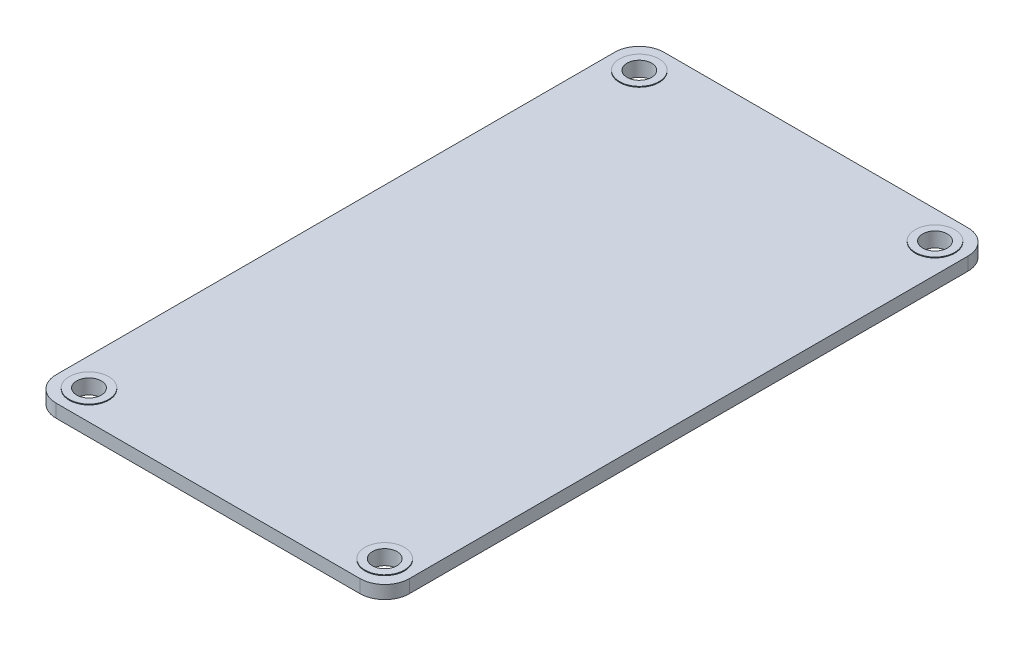
ISO-10303-21;
HEADER;
FILE_DESCRIPTION(('STEP AP214'),'2;1');
FILE_NAME('part.step','',(''),(''),'','','');
FILE_SCHEMA(('AUTOMOTIVE_DESIGN { 1 0 10303 214 1 1 1 1 }'));
ENDSEC;
DATA;
#1=APPLICATION_CONTEXT('core data for automotive mechanical design processes');
#2=APPLICATION_PROTOCOL_DEFINITION('international standard','automotive_design',2000,#1);
#3=PRODUCT_CONTEXT('',#1,'mechanical');
#4=PRODUCT('Part','Part','',(#3));
#5=PRODUCT_RELATED_PRODUCT_CATEGORY('part','',(#4));
#6=PRODUCT_DEFINITION_FORMATION('','',#4);
#7=PRODUCT_DEFINITION_CONTEXT('part definition',#1,'design');
#8=PRODUCT_DEFINITION('design','',#6,#7);
#9=PRODUCT_DEFINITION_SHAPE('','',#8);
#10=(LENGTH_UNIT() NAMED_UNIT(*) SI_UNIT(.MILLI.,.METRE.));
#11=(NAMED_UNIT(*) PLANE_ANGLE_UNIT() SI_UNIT($,.RADIAN.));
#12=(NAMED_UNIT(*) SI_UNIT($,.STERADIAN.) SOLID_ANGLE_UNIT());
#13=UNCERTAINTY_MEASURE_WITH_UNIT(LENGTH_MEASURE(1.E-05),#10,'distance_accuracy_value','');
#14=(GEOMETRIC_REPRESENTATION_CONTEXT(3) GLOBAL_UNCERTAINTY_ASSIGNED_CONTEXT((#13)) GLOBAL_UNIT_ASSIGNED_CONTEXT((#10,
#11,#12)) REPRESENTATION_CONTEXT('',''));
#15=CARTESIAN_POINT('',(0.,0.,0.));
#16=DIRECTION('',(0.,0.,1.));
#17=DIRECTION('',(1.,0.,0.));
#18=AXIS2_PLACEMENT_3D('',#15,#16,#17);
#19=CARTESIAN_POINT('',(-6.79987151274164,-0.1,12.667665293411));
#20=DIRECTION('',(0.,1.,0.));
#21=DIRECTION('',(0.,0.,1.));
#22=AXIS2_PLACEMENT_3D('',#19,#20,#21);
#23=CYLINDRICAL_SURFACE('',#22,2.4);
#24=CARTESIAN_POINT('',(-6.79987151274164,1.7,12.667665293411));
#25=DIRECTION('',(0.,1.,0.));
#26=DIRECTION('',(0.,0.,1.));
#27=AXIS2_PLACEMENT_3D('',#24,#25,#26);
#28=CIRCLE('',#27,2.4);
#29=CARTESIAN_POINT('',(-6.79987151274164,1.7,15.067665293411));
#30=VERTEX_POINT('',#29);
#31=EDGE_CURVE('P0_E19',#30,#30,#28,.T.);
#32=ORIENTED_EDGE('',*,*,#31,.F.);
#33=EDGE_LOOP('',(#32));
#34=FACE_BOUND('',#33,.T.);
#35=CARTESIAN_POINT('',(-6.79987151274164,-0.1,12.667665293411));
#36=DIRECTION('',(0.,1.,0.));
#37=DIRECTION('',(0.,0.,1.));
#38=AXIS2_PLACEMENT_3D('',#35,#36,#37);
#39=CIRCLE('',#38,2.4);
#40=CARTESIAN_POINT('',(-6.79987151274164,-0.1,15.067665293411));
#41=VERTEX_POINT('',#40);
#42=EDGE_CURVE('P0_E28',#41,#41,#39,.F.);
#43=ORIENTED_EDGE('',*,*,#42,.F.);
#44=EDGE_LOOP('',(#43));
#45=FACE_BOUND('',#44,.T.);
#46=ADVANCED_FACE('P0_F15',(#34,#45),#23,.T.);
#47=CARTESIAN_POINT('',(-9.20987151274164,1.7,10.257665293411));
#48=DIRECTION('',(0.,1.,0.));
#49=DIRECTION('',(0.,0.,1.));
#50=AXIS2_PLACEMENT_3D('',#47,#48,#49);
#51=PLANE('',#50);
#52=CARTESIAN_POINT('',(-6.79987151274164,1.7,12.667665293411));
#53=DIRECTION('',(0.,-1.,0.));
#54=DIRECTION('',(0.,0.,-1.));
#55=AXIS2_PLACEMENT_3D('',#52,#53,#54);
#56=CIRCLE('',#55,1.5);
#57=CARTESIAN_POINT('',(-6.79987151274164,1.7,11.167665293411));
#58=VERTEX_POINT('',#57);
#59=EDGE_CURVE('P0_E23',#58,#58,#56,.F.);
#60=ORIENTED_EDGE('',*,*,#59,.F.);
#61=EDGE_LOOP('',(#60));
#62=FACE_BOUND('',#61,.T.);
#63=ORIENTED_EDGE('',*,*,#31,.T.);
#64=EDGE_LOOP('',(#63));
#65=FACE_BOUND('',#64,.T.);
#66=ADVANCED_FACE('P0_F36',(#62,#65),#51,.T.);
#67=CARTESIAN_POINT('',(-9.20987151274164,-0.1,15.077665293411));
#68=DIRECTION('',(0.,-1.,0.));
#69=DIRECTION('',(0.,0.,-1.));
#70=AXIS2_PLACEMENT_3D('',#67,#68,#69);
#71=PLANE('',#70);
#72=CARTESIAN_POINT('',(-6.79987151274164,-0.1,12.667665293411));
#73=DIRECTION('',(0.,-1.,0.));
#74=DIRECTION('',(0.,0.,-1.));
#75=AXIS2_PLACEMENT_3D('',#72,#73,#74);
#76=CIRCLE('',#75,1.5);
#77=CARTESIAN_POINT('',(-6.79987151274164,-0.1,11.167665293411));
#78=VERTEX_POINT('',#77);
#79=EDGE_CURVE('P0_E10',#78,#78,#76,.T.);
#80=ORIENTED_EDGE('',*,*,#79,.F.);
#81=EDGE_LOOP('',(#80));
#82=FACE_BOUND('',#81,.T.);
#83=ORIENTED_EDGE('',*,*,#42,.T.);
#84=EDGE_LOOP('',(#83));
#85=FACE_BOUND('',#84,.T.);
#86=ADVANCED_FACE('P0_F45',(#82,#85),#71,.T.);
#87=CARTESIAN_POINT('',(-6.79987151274164,1.7,12.667665293411));
#88=DIRECTION('',(0.,-1.,0.));
#89=DIRECTION('',(0.,0.,-1.));
#90=AXIS2_PLACEMENT_3D('',#87,#88,#89);
#91=CYLINDRICAL_SURFACE('',#90,1.5);
#92=ORIENTED_EDGE('',*,*,#79,.T.);
#93=EDGE_LOOP('',(#92));
#94=FACE_BOUND('',#93,.T.);
#95=ORIENTED_EDGE('',*,*,#59,.T.);
#96=EDGE_LOOP('',(#95));
#97=FACE_BOUND('',#96,.T.);
#98=ADVANCED_FACE('P0_F17',(#94,#97),#91,.F.);
#99=CLOSED_SHELL('',(#46,#66,#86,#98));
#100=MANIFOLD_SOLID_BREP('P0_B1',#99);
#101=CARTESIAN_POINT('',(29.2001284872584,-0.1,-54.332334706589));
#102=DIRECTION('',(0.,1.,0.));
#103=DIRECTION('',(0.,0.,1.));
#104=AXIS2_PLACEMENT_3D('',#101,#102,#103);
#105=CYLINDRICAL_SURFACE('',#104,2.4);
#106=CARTESIAN_POINT('',(29.2001284872584,1.7,-54.332334706589));
#107=DIRECTION('',(0.,1.,0.));
#108=DIRECTION('',(0.,0.,1.));
#109=AXIS2_PLACEMENT_3D('',#106,#107,#108);
#110=CIRCLE('',#109,2.4);
#111=CARTESIAN_POINT('',(29.2001284872584,1.7,-51.932334706589));
#112=VERTEX_POINT('',#111);
#113=EDGE_CURVE('P1_E19',#112,#112,#110,.T.);
#114=ORIENTED_EDGE('',*,*,#113,.F.);
#115=EDGE_LOOP('',(#114));
#116=FACE_BOUND('',#115,.T.);
#117=CARTESIAN_POINT('',(29.2001284872584,-0.1,-54.332334706589));
#118=DIRECTION('',(0.,1.,0.));
#119=DIRECTION('',(0.,0.,1.));
#120=AXIS2_PLACEMENT_3D('',#117,#118,#119);
#121=CIRCLE('',#120,2.4);
#122=CARTESIAN_POINT('',(29.2001284872584,-0.1,-51.932334706589));
#123=VERTEX_POINT('',#122);
#124=EDGE_CURVE('P1_E28',#123,#123,#121,.F.);
#125=ORIENTED_EDGE('',*,*,#124,.F.);
#126=EDGE_LOOP('',(#125));
#127=FACE_BOUND('',#126,.T.);
#128=ADVANCED_FACE('P1_F15',(#116,#127),#105,.T.);
#129=CARTESIAN_POINT('',(26.7901284872584,1.7,-56.742334706589));
#130=DIRECTION('',(0.,1.,0.));
#131=DIRECTION('',(0.,0.,1.));
#132=AXIS2_PLACEMENT_3D('',#129,#130,#131);
#133=PLANE('',#132);
#134=CARTESIAN_POINT('',(29.2001284872584,1.7,-54.332334706589));
#135=DIRECTION('',(0.,-1.,0.));
#136=DIRECTION('',(0.,0.,-1.));
#137=AXIS2_PLACEMENT_3D('',#134,#135,#136);
#138=CIRCLE('',#137,1.50000000000001);
#139=CARTESIAN_POINT('',(29.2001284872584,1.7,-55.832334706589));
#140=VERTEX_POINT('',#139);
#141=EDGE_CURVE('P1_E23',#140,#140,#138,.F.);
#142=ORIENTED_EDGE('',*,*,#141,.F.);
#143=EDGE_LOOP('',(#142));
#144=FACE_BOUND('',#143,.T.);
#145=ORIENTED_EDGE('',*,*,#113,.T.);
#146=EDGE_LOOP('',(#145));
#147=FACE_BOUND('',#146,.T.);
#148=ADVANCED_FACE('P1_F36',(#144,#147),#133,.T.);
#149=CARTESIAN_POINT('',(26.7901284872584,-0.1,-51.922334706589));
#150=DIRECTION('',(0.,-1.,0.));
#151=DIRECTION('',(0.,0.,-1.));
#152=AXIS2_PLACEMENT_3D('',#149,#150,#151);
#153=PLANE('',#152);
#154=CARTESIAN_POINT('',(29.2001284872584,-0.1,-54.332334706589));
#155=DIRECTION('',(0.,-1.,0.));
#156=DIRECTION('',(0.,0.,-1.));
#157=AXIS2_PLACEMENT_3D('',#154,#155,#156);
#158=CIRCLE('',#157,1.50000000000001);
#159=CARTESIAN_POINT('',(29.2001284872584,-0.1,-55.832334706589));
#160=VERTEX_POINT('',#159);
#161=EDGE_CURVE('P1_E10',#160,#160,#158,.T.);
#162=ORIENTED_EDGE('',*,*,#161,.F.);
#163=EDGE_LOOP('',(#162));
#164=FACE_BOUND('',#163,.T.);
#165=ORIENTED_EDGE('',*,*,#124,.T.);
#166=EDGE_LOOP('',(#165));
#167=FACE_BOUND('',#166,.T.);
#168=ADVANCED_FACE('P1_F45',(#164,#167),#153,.T.);
#169=CARTESIAN_POINT('',(29.2001284872584,1.7,-54.332334706589));
#170=DIRECTION('',(0.,-1.,0.));
#171=DIRECTION('',(0.,0.,-1.));
#172=AXIS2_PLACEMENT_3D('',#169,#170,#171);
#173=CYLINDRICAL_SURFACE('',#172,1.50000000000001);
#174=ORIENTED_EDGE('',*,*,#161,.T.);
#175=EDGE_LOOP('',(#174));
#176=FACE_BOUND('',#175,.T.);
#177=ORIENTED_EDGE('',*,*,#141,.T.);
#178=EDGE_LOOP('',(#177));
#179=FACE_BOUND('',#178,.T.);
#180=ADVANCED_FACE('P1_F17',(#176,#179),#173,.F.);
#181=CLOSED_SHELL('',(#128,#148,#168,#180));
#182=MANIFOLD_SOLID_BREP('P1_B1',#181);
#183=CARTESIAN_POINT('',(-10.2998715127416,-0.01,-54.842334706589));
#184=DIRECTION('',(-1.,0.,0.));
#185=DIRECTION('',(0.,0.,1.));
#186=AXIS2_PLACEMENT_3D('',#183,#184,#185);
#187=PLANE('',#186);
#188=DIRECTION('',(0.,0.,1.));
#189=VECTOR('',#188,1.);
#190=CARTESIAN_POINT('',(-10.2998715127416,1.6,-20.832334706589));
#191=LINE('',#190,#189);
#192=CARTESIAN_POINT('',(-10.2998715127416,1.6,-54.832334706589));
#193=VERTEX_POINT('',#192);
#194=CARTESIAN_POINT('',(-10.2998715127416,1.6,13.167665293411));
#195=VERTEX_POINT('',#194);
#196=EDGE_CURVE('P2_E142',#193,#195,#191,.T.);
#197=ORIENTED_EDGE('',*,*,#196,.F.);
#198=DIRECTION('',(0.,1.,0.));
#199=VECTOR('',#198,1.);
#200=CARTESIAN_POINT('',(-10.2998715127416,0.8,-54.832334706589));
#201=LINE('',#200,#199);
#202=CARTESIAN_POINT('',(-10.2998715127416,0.,-54.832334706589));
#203=VERTEX_POINT('',#202);
#204=EDGE_CURVE('P2_E79',#203,#193,#201,.T.);
#205=ORIENTED_EDGE('',*,*,#204,.F.);
#206=DIRECTION('',(0.,0.,-1.));
#207=VECTOR('',#206,1.);
#208=CARTESIAN_POINT('',(-10.2998715127416,0.,-20.832334706589));
#209=LINE('',#208,#207);
#210=CARTESIAN_POINT('',(-10.2998715127416,0.,13.167665293411));
#211=VERTEX_POINT('',#210);
#212=EDGE_CURVE('P2_E88',#211,#203,#209,.T.);
#213=ORIENTED_EDGE('',*,*,#212,.F.);
#214=DIRECTION('',(0.,-1.,0.));
#215=VECTOR('',#214,1.);
#216=CARTESIAN_POINT('',(-10.2998715127416,0.8,13.167665293411));
#217=LINE('',#216,#215);
#218=EDGE_CURVE('P2_E115',#195,#211,#217,.T.);
#219=ORIENTED_EDGE('',*,*,#218,.F.);
#220=EDGE_LOOP('',(#197,#205,#213,#219));
#221=FACE_BOUND('',#220,.T.);
#222=ADVANCED_FACE('P2_F16',(#221),#187,.T.);
#223=CARTESIAN_POINT('',(-7.29987151274161,1.6,13.167665293411));
#224=DIRECTION('',(0.,-1.,0.));
#225=DIRECTION('',(1.,0.,0.));
#226=AXIS2_PLACEMENT_3D('',#223,#224,#225);
#227=CYLINDRICAL_SURFACE('',#226,3.);
#228=CARTESIAN_POINT('',(-7.29987151274161,1.6,13.167665293411));
#229=DIRECTION('',(0.,-1.,0.));
#230=DIRECTION('',(1.,0.,0.));
#231=AXIS2_PLACEMENT_3D('',#228,#229,#230);
#232=CIRCLE('',#231,3.);
#233=CARTESIAN_POINT('',(-7.29987151274161,1.6,16.167665293411));
#234=VERTEX_POINT('',#233);
#235=EDGE_CURVE('P2_E139',#195,#234,#232,.F.);
#236=ORIENTED_EDGE('',*,*,#235,.F.);
#237=ORIENTED_EDGE('',*,*,#218,.T.);
#238=CARTESIAN_POINT('',(-7.29987151274161,0.,13.167665293411));
#239=DIRECTION('',(0.,-1.,0.));
#240=DIRECTION('',(1.,0.,0.));
#241=AXIS2_PLACEMENT_3D('',#238,#239,#240);
#242=CIRCLE('',#241,3.);
#243=CARTESIAN_POINT('',(-7.29987151274161,0.,16.167665293411));
#244=VERTEX_POINT('',#243);
#245=EDGE_CURVE('P2_E152',#244,#211,#242,.T.);
#246=ORIENTED_EDGE('',*,*,#245,.F.);
#247=DIRECTION('',(0.,-1.,0.));
#248=VECTOR('',#247,1.);
#249=CARTESIAN_POINT('',(-7.29987151274161,0.8,16.167665293411));
#250=LINE('',#249,#248);
#251=EDGE_CURVE('P2_E113',#234,#244,#250,.T.);
#252=ORIENTED_EDGE('',*,*,#251,.F.);
#253=EDGE_LOOP('',(#236,#237,#246,#252));
#254=FACE_BOUND('',#253,.T.);
#255=ADVANCED_FACE('P2_F187',(#254),#227,.T.);
#256=CARTESIAN_POINT('',(-7.30987151274162,-0.01,16.167665293411));
#257=DIRECTION('',(0.,0.,1.));
#258=DIRECTION('',(1.,0.,0.));
#259=AXIS2_PLACEMENT_3D('',#256,#257,#258);
#260=PLANE('',#259);
#261=DIRECTION('',(1.,0.,0.));
#262=VECTOR('',#261,1.);
#263=CARTESIAN_POINT('',(11.2001284872584,1.6,16.167665293411));
#264=LINE('',#263,#262);
#265=CARTESIAN_POINT('',(29.7001284872584,1.6,16.167665293411));
#266=VERTEX_POINT('',#265);
#267=EDGE_CURVE('P2_E138',#234,#266,#264,.T.);
#268=ORIENTED_EDGE('',*,*,#267,.F.);
#269=ORIENTED_EDGE('',*,*,#251,.T.);
#270=DIRECTION('',(-1.,0.,0.));
#271=VECTOR('',#270,1.);
#272=CARTESIAN_POINT('',(11.2001284872584,0.,16.167665293411));
#273=LINE('',#272,#271);
#274=CARTESIAN_POINT('',(29.7001284872584,0.,16.167665293411));
#275=VERTEX_POINT('',#274);
#276=EDGE_CURVE('P2_E154',#275,#244,#273,.T.);
#277=ORIENTED_EDGE('',*,*,#276,.F.);
#278=DIRECTION('',(0.,-1.,0.));
#279=VECTOR('',#278,1.);
#280=CARTESIAN_POINT('',(29.7001284872584,0.8,16.167665293411));
#281=LINE('',#280,#279);
#282=EDGE_CURVE('P2_E111',#266,#275,#281,.T.);
#283=ORIENTED_EDGE('',*,*,#282,.F.);
#284=EDGE_LOOP('',(#268,#269,#277,#283));
#285=FACE_BOUND('',#284,.T.);
#286=ADVANCED_FACE('P2_F184',(#285),#260,.T.);
#287=CARTESIAN_POINT('',(29.7001284872584,1.6,13.167665293411));
#288=DIRECTION('',(0.,-1.,0.));
#289=DIRECTION('',(0.,0.,-1.));
#290=AXIS2_PLACEMENT_3D('',#287,#288,#289);
#291=CYLINDRICAL_SURFACE('',#290,3.);
#292=CARTESIAN_POINT('',(29.7001284872584,1.6,13.167665293411));
#293=DIRECTION('',(0.,-1.,0.));
#294=DIRECTION('',(0.,0.,-1.));
#295=AXIS2_PLACEMENT_3D('',#292,#293,#294);
#296=CIRCLE('',#295,3.);
#297=CARTESIAN_POINT('',(32.7001284872584,1.6,13.167665293411));
#298=VERTEX_POINT('',#297);
#299=EDGE_CURVE('P2_E135',#266,#298,#296,.F.);
#300=ORIENTED_EDGE('',*,*,#299,.F.);
#301=ORIENTED_EDGE('',*,*,#282,.T.);
#302=CARTESIAN_POINT('',(29.7001284872584,0.,13.167665293411));
#303=DIRECTION('',(0.,-1.,0.));
#304=DIRECTION('',(0.,0.,-1.));
#305=AXIS2_PLACEMENT_3D('',#302,#303,#304);
#306=CIRCLE('',#305,3.);
#307=CARTESIAN_POINT('',(32.7001284872584,0.,13.167665293411));
#308=VERTEX_POINT('',#307);
#309=EDGE_CURVE('P2_E155',#308,#275,#306,.T.);
#310=ORIENTED_EDGE('',*,*,#309,.F.);
#311=DIRECTION('',(0.,-1.,0.));
#312=VECTOR('',#311,1.);
#313=CARTESIAN_POINT('',(32.7001284872584,0.8,13.167665293411));
#314=LINE('',#313,#312);
#315=EDGE_CURVE('P2_E109',#298,#308,#314,.T.);
#316=ORIENTED_EDGE('',*,*,#315,.F.);
#317=EDGE_LOOP('',(#300,#301,#310,#316));
#318=FACE_BOUND('',#317,.T.);
#319=ADVANCED_FACE('P2_F179',(#318),#291,.T.);
#320=CARTESIAN_POINT('',(32.7001284872584,-0.01,13.177665293411));
#321=DIRECTION('',(1.,0.,0.));
#322=DIRECTION('',(0.,0.,-1.));
#323=AXIS2_PLACEMENT_3D('',#320,#321,#322);
#324=PLANE('',#323);
#325=DIRECTION('',(0.,0.,-1.));
#326=VECTOR('',#325,1.);
#327=CARTESIAN_POINT('',(32.7001284872584,1.6,-20.832334706589));
#328=LINE('',#327,#326);
#329=CARTESIAN_POINT('',(32.7001284872584,1.6,-54.832334706589));
#330=VERTEX_POINT('',#329);
#331=EDGE_CURVE('P2_E134',#298,#330,#328,.T.);
#332=ORIENTED_EDGE('',*,*,#331,.F.);
#333=ORIENTED_EDGE('',*,*,#315,.T.);
#334=DIRECTION('',(0.,0.,1.));
#335=VECTOR('',#334,1.);
#336=CARTESIAN_POINT('',(32.7001284872584,0.,-20.832334706589));
#337=LINE('',#336,#335);
#338=CARTESIAN_POINT('',(32.7001284872584,0.,-54.832334706589));
#339=VERTEX_POINT('',#338);
#340=EDGE_CURVE('P2_E157',#339,#308,#337,.T.);
#341=ORIENTED_EDGE('',*,*,#340,.F.);
#342=DIRECTION('',(0.,-1.,0.));
#343=VECTOR('',#342,1.);
#344=CARTESIAN_POINT('',(32.7001284872584,0.8,-54.832334706589));
#345=LINE('',#344,#343);
#346=EDGE_CURVE('P2_E107',#330,#339,#345,.T.);
#347=ORIENTED_EDGE('',*,*,#346,.F.);
#348=EDGE_LOOP('',(#332,#333,#341,#347));
#349=FACE_BOUND('',#348,.T.);
#350=ADVANCED_FACE('P2_F175',(#349),#324,.T.);
#351=CARTESIAN_POINT('',(29.7001284872583,1.6,-54.8323347065889));
#352=DIRECTION('',(0.,-1.,0.));
#353=DIRECTION('',(0.,0.,-1.));
#354=AXIS2_PLACEMENT_3D('',#351,#352,#353);
#355=CYLINDRICAL_SURFACE('',#354,3.00000000000009);
#356=CARTESIAN_POINT('',(29.7001284872583,1.6,-54.8323347065889));
#357=DIRECTION('',(0.,-1.,0.));
#358=DIRECTION('',(0.,0.,-1.));
#359=AXIS2_PLACEMENT_3D('',#356,#357,#358);
#360=CIRCLE('',#359,3.00000000000009);
#361=CARTESIAN_POINT('',(29.7001284872584,1.6,-57.832334706589));
#362=VERTEX_POINT('',#361);
#363=EDGE_CURVE('P2_E131',#330,#362,#360,.F.);
#364=ORIENTED_EDGE('',*,*,#363,.F.);
#365=ORIENTED_EDGE('',*,*,#346,.T.);
#366=CARTESIAN_POINT('',(29.7001284872583,0.,-54.8323347065889));
#367=DIRECTION('',(0.,-1.,0.));
#368=DIRECTION('',(0.,0.,-1.));
#369=AXIS2_PLACEMENT_3D('',#366,#367,#368);
#370=CIRCLE('',#369,3.00000000000009);
#371=CARTESIAN_POINT('',(29.7001284872584,0.,-57.832334706589));
#372=VERTEX_POINT('',#371);
#373=EDGE_CURVE('P2_E97',#372,#339,#370,.T.);
#374=ORIENTED_EDGE('',*,*,#373,.F.);
#375=DIRECTION('',(0.,-1.,0.));
#376=VECTOR('',#375,1.);
#377=CARTESIAN_POINT('',(29.7001284872584,0.8,-57.832334706589));
#378=LINE('',#377,#376);
#379=EDGE_CURVE('P2_E93',#362,#372,#378,.T.);
#380=ORIENTED_EDGE('',*,*,#379,.F.);
#381=EDGE_LOOP('',(#364,#365,#374,#380));
#382=FACE_BOUND('',#381,.T.);
#383=ADVANCED_FACE('P2_F173',(#382),#355,.T.);
#384=CARTESIAN_POINT('',(29.7101284872583,-0.01,-57.832334706589));
#385=DIRECTION('',(0.,0.,-1.));
#386=DIRECTION('',(-1.,0.,0.));
#387=AXIS2_PLACEMENT_3D('',#384,#385,#386);
#388=PLANE('',#387);
#389=DIRECTION('',(-1.,0.,0.));
#390=VECTOR('',#389,1.);
#391=CARTESIAN_POINT('',(11.2001284872584,1.6,-57.832334706589));
#392=LINE('',#391,#390);
#393=CARTESIAN_POINT('',(-7.29987151274164,1.6,-57.832334706589));
#394=VERTEX_POINT('',#393);
#395=EDGE_CURVE('P2_E130',#362,#394,#392,.T.);
#396=ORIENTED_EDGE('',*,*,#395,.F.);
#397=ORIENTED_EDGE('',*,*,#379,.T.);
#398=DIRECTION('',(1.,0.,0.));
#399=VECTOR('',#398,1.);
#400=CARTESIAN_POINT('',(11.2001284872584,0.,-57.832334706589));
#401=LINE('',#400,#399);
#402=CARTESIAN_POINT('',(-7.29987151274164,0.,-57.832334706589));
#403=VERTEX_POINT('',#402);
#404=EDGE_CURVE('P2_E91',#403,#372,#401,.T.);
#405=ORIENTED_EDGE('',*,*,#404,.F.);
#406=DIRECTION('',(0.,-1.,0.));
#407=VECTOR('',#406,1.);
#408=CARTESIAN_POINT('',(-7.29987151274164,0.8,-57.832334706589));
#409=LINE('',#408,#407);
#410=EDGE_CURVE('P2_E35',#394,#403,#409,.T.);
#411=ORIENTED_EDGE('',*,*,#410,.F.);
#412=EDGE_LOOP('',(#396,#397,#405,#411));
#413=FACE_BOUND('',#412,.T.);
#414=ADVANCED_FACE('P2_F92',(#413),#388,.T.);
#415=CARTESIAN_POINT('',(-7.29987151274163,1.6,-54.832334706589));
#416=DIRECTION('',(0.,-1.,0.));
#417=DIRECTION('',(0.,0.,-1.));
#418=AXIS2_PLACEMENT_3D('',#415,#416,#417);
#419=CYLINDRICAL_SURFACE('',#418,2.99999999999998);
#420=CARTESIAN_POINT('',(-7.29987151274163,1.6,-54.832334706589));
#421=DIRECTION('',(0.,-1.,0.));
#422=DIRECTION('',(0.,0.,-1.));
#423=AXIS2_PLACEMENT_3D('',#420,#421,#422);
#424=CIRCLE('',#423,2.99999999999998);
#425=EDGE_CURVE('P2_E86',#394,#193,#424,.F.);
#426=ORIENTED_EDGE('',*,*,#425,.F.);
#427=ORIENTED_EDGE('',*,*,#410,.T.);
#428=CARTESIAN_POINT('',(-7.29987151274163,0.,-54.832334706589));
#429=DIRECTION('',(0.,-1.,0.));
#430=DIRECTION('',(0.,0.,-1.));
#431=AXIS2_PLACEMENT_3D('',#428,#429,#430);
#432=CIRCLE('',#431,2.99999999999998);
#433=EDGE_CURVE('P2_E20',#203,#403,#432,.T.);
#434=ORIENTED_EDGE('',*,*,#433,.F.);
#435=ORIENTED_EDGE('',*,*,#204,.T.);
#436=EDGE_LOOP('',(#426,#427,#434,#435));
#437=FACE_BOUND('',#436,.T.);
#438=ADVANCED_FACE('P2_F82',(#437),#419,.T.);
#439=CARTESIAN_POINT('',(29.2001284872583,0.,-54.332334706589));
#440=DIRECTION('',(0.,1.,0.));
#441=DIRECTION('',(0.,0.,1.));
#442=AXIS2_PLACEMENT_3D('',#439,#440,#441);
#443=CYLINDRICAL_SURFACE('',#442,1.59999999999999);
#444=CARTESIAN_POINT('',(29.2001284872583,1.6,-54.332334706589));
#445=DIRECTION('',(0.,1.,0.));
#446=DIRECTION('',(0.,0.,1.));
#447=AXIS2_PLACEMENT_3D('',#444,#445,#446);
#448=CIRCLE('',#447,1.59999999999999);
#449=CARTESIAN_POINT('',(29.2001284872583,1.6,-52.732334706589));
#450=VERTEX_POINT('',#449);
#451=EDGE_CURVE('P2_E126',#450,#450,#448,.F.);
#452=ORIENTED_EDGE('',*,*,#451,.F.);
#453=EDGE_LOOP('',(#452));
#454=FACE_BOUND('',#453,.T.);
#455=CARTESIAN_POINT('',(29.2001284872583,0.,-54.332334706589));
#456=DIRECTION('',(0.,1.,0.));
#457=DIRECTION('',(0.,0.,1.));
#458=AXIS2_PLACEMENT_3D('',#455,#456,#457);
#459=CIRCLE('',#458,1.59999999999999);
#460=CARTESIAN_POINT('',(29.2001284872583,0.,-52.732334706589));
#461=VERTEX_POINT('',#460);
#462=EDGE_CURVE('P2_E149',#461,#461,#459,.T.);
#463=ORIENTED_EDGE('',*,*,#462,.F.);
#464=EDGE_LOOP('',(#463));
#465=FACE_BOUND('',#464,.T.);
#466=ADVANCED_FACE('P2_F219',(#454,#465),#443,.F.);
#467=CARTESIAN_POINT('',(29.2001284872584,0.,12.667665293411));
#468=DIRECTION('',(0.,1.,0.));
#469=DIRECTION('',(0.,0.,1.));
#470=AXIS2_PLACEMENT_3D('',#467,#468,#469);
#471=CYLINDRICAL_SURFACE('',#470,1.6);
#472=CARTESIAN_POINT('',(29.2001284872584,1.6,12.667665293411));
#473=DIRECTION('',(0.,1.,0.));
#474=DIRECTION('',(0.,0.,1.));
#475=AXIS2_PLACEMENT_3D('',#472,#473,#474);
#476=CIRCLE('',#475,1.6);
#477=CARTESIAN_POINT('',(29.2001284872584,1.6,14.267665293411));
#478=VERTEX_POINT('',#477);
#479=EDGE_CURVE('P2_E123',#478,#478,#476,.F.);
#480=ORIENTED_EDGE('',*,*,#479,.F.);
#481=EDGE_LOOP('',(#480));
#482=FACE_BOUND('',#481,.T.);
#483=CARTESIAN_POINT('',(29.2001284872584,0.,12.667665293411));
#484=DIRECTION('',(0.,1.,0.));
#485=DIRECTION('',(0.,0.,1.));
#486=AXIS2_PLACEMENT_3D('',#483,#484,#485);
#487=CIRCLE('',#486,1.6);
#488=CARTESIAN_POINT('',(29.2001284872584,0.,14.267665293411));
#489=VERTEX_POINT('',#488);
#490=EDGE_CURVE('P2_E146',#489,#489,#487,.T.);
#491=ORIENTED_EDGE('',*,*,#490,.F.);
#492=EDGE_LOOP('',(#491));
#493=FACE_BOUND('',#492,.T.);
#494=ADVANCED_FACE('P2_F212',(#482,#493),#471,.F.);
#495=CARTESIAN_POINT('',(-6.79987151274164,0.,12.667665293411));
#496=DIRECTION('',(0.,1.,0.));
#497=DIRECTION('',(0.,0.,1.));
#498=AXIS2_PLACEMENT_3D('',#495,#496,#497);
#499=CYLINDRICAL_SURFACE('',#498,1.6);
#500=CARTESIAN_POINT('',(-6.79987151274164,1.6,12.667665293411));
#501=DIRECTION('',(0.,1.,0.));
#502=DIRECTION('',(0.,0.,1.));
#503=AXIS2_PLACEMENT_3D('',#500,#501,#502);
#504=CIRCLE('',#503,1.6);
#505=CARTESIAN_POINT('',(-6.79987151274164,1.6,14.267665293411));
#506=VERTEX_POINT('',#505);
#507=EDGE_CURVE('P2_E120',#506,#506,#504,.F.);
#508=ORIENTED_EDGE('',*,*,#507,.F.);
#509=EDGE_LOOP('',(#508));
#510=FACE_BOUND('',#509,.T.);
#511=CARTESIAN_POINT('',(-6.79987151274164,0.,12.667665293411));
#512=DIRECTION('',(0.,1.,0.));
#513=DIRECTION('',(0.,0.,1.));
#514=AXIS2_PLACEMENT_3D('',#511,#512,#513);
#515=CIRCLE('',#514,1.6);
#516=CARTESIAN_POINT('',(-6.79987151274164,0.,14.267665293411));
#517=VERTEX_POINT('',#516);
#518=EDGE_CURVE('P2_E143',#517,#517,#515,.T.);
#519=ORIENTED_EDGE('',*,*,#518,.F.);
#520=EDGE_LOOP('',(#519));
#521=FACE_BOUND('',#520,.T.);
#522=ADVANCED_FACE('P2_F206',(#510,#521),#499,.F.);
#523=CARTESIAN_POINT('',(-10.3098715127416,0.,16.177665293411));
#524=DIRECTION('',(0.,-1.,0.));
#525=DIRECTION('',(0.,0.,-1.));
#526=AXIS2_PLACEMENT_3D('',#523,#524,#525);
#527=PLANE('',#526);
#528=ORIENTED_EDGE('',*,*,#518,.T.);
#529=EDGE_LOOP('',(#528));
#530=FACE_BOUND('',#529,.T.);
#531=ORIENTED_EDGE('',*,*,#490,.T.);
#532=EDGE_LOOP('',(#531));
#533=FACE_BOUND('',#532,.T.);
#534=ORIENTED_EDGE('',*,*,#462,.T.);
#535=EDGE_LOOP('',(#534));
#536=FACE_BOUND('',#535,.T.);
#537=CARTESIAN_POINT('',(-6.79987151274167,0.,-54.332334706589));
#538=DIRECTION('',(0.,1.,0.));
#539=DIRECTION('',(0.,0.,1.));
#540=AXIS2_PLACEMENT_3D('',#537,#538,#539);
#541=CIRCLE('',#540,1.6);
#542=CARTESIAN_POINT('',(-6.79987151274167,0.,-52.732334706589));
#543=VERTEX_POINT('',#542);
#544=EDGE_CURVE('P2_E26',#543,#543,#541,.F.);
#545=ORIENTED_EDGE('',*,*,#544,.F.);
#546=EDGE_LOOP('',(#545));
#547=FACE_BOUND('',#546,.T.);
#548=ORIENTED_EDGE('',*,*,#276,.T.);
#549=ORIENTED_EDGE('',*,*,#245,.T.);
#550=ORIENTED_EDGE('',*,*,#212,.T.);
#551=ORIENTED_EDGE('',*,*,#433,.T.);
#552=ORIENTED_EDGE('',*,*,#404,.T.);
#553=ORIENTED_EDGE('',*,*,#373,.T.);
#554=ORIENTED_EDGE('',*,*,#340,.T.);
#555=ORIENTED_EDGE('',*,*,#309,.T.);
#556=EDGE_LOOP('',(#548,#549,#550,#551,#552,#553,#554,#555));
#557=FACE_BOUND('',#556,.T.);
#558=ADVANCED_FACE('P2_F100',(#530,#533,#536,#547,#557),#527,.T.);
#559=CARTESIAN_POINT('',(-10.3098715127416,1.6,-57.842334706589));
#560=DIRECTION('',(0.,1.,0.));
#561=DIRECTION('',(0.,0.,1.));
#562=AXIS2_PLACEMENT_3D('',#559,#560,#561);
#563=PLANE('',#562);
#564=ORIENTED_EDGE('',*,*,#507,.T.);
#565=EDGE_LOOP('',(#564));
#566=FACE_BOUND('',#565,.T.);
#567=ORIENTED_EDGE('',*,*,#479,.T.);
#568=EDGE_LOOP('',(#567));
#569=FACE_BOUND('',#568,.T.);
#570=ORIENTED_EDGE('',*,*,#451,.T.);
#571=EDGE_LOOP('',(#570));
#572=FACE_BOUND('',#571,.T.);
#573=CARTESIAN_POINT('',(-6.79987151274167,1.6,-54.332334706589));
#574=DIRECTION('',(0.,1.,0.));
#575=DIRECTION('',(0.,0.,1.));
#576=AXIS2_PLACEMENT_3D('',#573,#574,#575);
#577=CIRCLE('',#576,1.6);
#578=CARTESIAN_POINT('',(-6.79987151274167,1.6,-52.732334706589));
#579=VERTEX_POINT('',#578);
#580=EDGE_CURVE('P2_E11',#579,#579,#577,.T.);
#581=ORIENTED_EDGE('',*,*,#580,.F.);
#582=EDGE_LOOP('',(#581));
#583=FACE_BOUND('',#582,.T.);
#584=ORIENTED_EDGE('',*,*,#395,.T.);
#585=ORIENTED_EDGE('',*,*,#425,.T.);
#586=ORIENTED_EDGE('',*,*,#196,.T.);
#587=ORIENTED_EDGE('',*,*,#235,.T.);
#588=ORIENTED_EDGE('',*,*,#267,.T.);
#589=ORIENTED_EDGE('',*,*,#299,.T.);
#590=ORIENTED_EDGE('',*,*,#331,.T.);
#591=ORIENTED_EDGE('',*,*,#363,.T.);
#592=EDGE_LOOP('',(#584,#585,#586,#587,#588,#589,#590,#591));
#593=FACE_BOUND('',#592,.T.);
#594=ADVANCED_FACE('P2_F169',(#566,#569,#572,#583,#593),#563,.T.);
#595=CARTESIAN_POINT('',(-6.79987151274167,0.,-54.332334706589));
#596=DIRECTION('',(0.,1.,0.));
#597=DIRECTION('',(0.,0.,1.));
#598=AXIS2_PLACEMENT_3D('',#595,#596,#597);
#599=CYLINDRICAL_SURFACE('',#598,1.6);
#600=ORIENTED_EDGE('',*,*,#580,.T.);
#601=EDGE_LOOP('',(#600));
#602=FACE_BOUND('',#601,.T.);
#603=ORIENTED_EDGE('',*,*,#544,.T.);
#604=EDGE_LOOP('',(#603));
#605=FACE_BOUND('',#604,.T.);
#606=ADVANCED_FACE('P2_F18',(#602,#605),#599,.F.);
#607=CLOSED_SHELL('',(#222,#255,#286,#319,#350,#383,#414,#438,#466,#494,#522,#558,#594,#606));
#608=MANIFOLD_SOLID_BREP('P2_B1',#607);
#609=CARTESIAN_POINT('',(-6.79987151274167,-0.1,-54.332334706589));
#610=DIRECTION('',(0.,1.,0.));
#611=DIRECTION('',(0.,0.,1.));
#612=AXIS2_PLACEMENT_3D('',#609,#610,#611);
#613=CYLINDRICAL_SURFACE('',#612,2.4);
#614=CARTESIAN_POINT('',(-6.79987151274167,1.7,-54.332334706589));
#615=DIRECTION('',(0.,1.,0.));
#616=DIRECTION('',(0.,0.,1.));
#617=AXIS2_PLACEMENT_3D('',#614,#615,#616);
#618=CIRCLE('',#617,2.4);
#619=CARTESIAN_POINT('',(-6.79987151274167,1.7,-51.932334706589));
#620=VERTEX_POINT('',#619);
#621=EDGE_CURVE('P3_E19',#620,#620,#618,.T.);
#622=ORIENTED_EDGE('',*,*,#621,.F.);
#623=EDGE_LOOP('',(#622));
#624=FACE_BOUND('',#623,.T.);
#625=CARTESIAN_POINT('',(-6.79987151274167,-0.1,-54.332334706589));
#626=DIRECTION('',(0.,1.,0.));
#627=DIRECTION('',(0.,0.,1.));
#628=AXIS2_PLACEMENT_3D('',#625,#626,#627);
#629=CIRCLE('',#628,2.4);
#630=CARTESIAN_POINT('',(-6.79987151274167,-0.1,-51.932334706589));
#631=VERTEX_POINT('',#630);
#632=EDGE_CURVE('P3_E28',#631,#631,#629,.F.);
#633=ORIENTED_EDGE('',*,*,#632,.F.);
#634=EDGE_LOOP('',(#633));
#635=FACE_BOUND('',#634,.T.);
#636=ADVANCED_FACE('P3_F15',(#624,#635),#613,.T.);
#637=CARTESIAN_POINT('',(-9.20987151274167,1.7,-56.742334706589));
#638=DIRECTION('',(0.,1.,0.));
#639=DIRECTION('',(0.,0.,1.));
#640=AXIS2_PLACEMENT_3D('',#637,#638,#639);
#641=PLANE('',#640);
#642=CARTESIAN_POINT('',(-6.79987151274168,1.7,-54.332334706589));
#643=DIRECTION('',(0.,-1.,0.));
#644=DIRECTION('',(0.,0.,-1.));
#645=AXIS2_PLACEMENT_3D('',#642,#643,#644);
#646=CIRCLE('',#645,1.50000000000001);
#647=CARTESIAN_POINT('',(-6.79987151274168,1.7,-55.832334706589));
#648=VERTEX_POINT('',#647);
#649=EDGE_CURVE('P3_E23',#648,#648,#646,.F.);
#650=ORIENTED_EDGE('',*,*,#649,.F.);
#651=EDGE_LOOP('',(#650));
#652=FACE_BOUND('',#651,.T.);
#653=ORIENTED_EDGE('',*,*,#621,.T.);
#654=EDGE_LOOP('',(#653));
#655=FACE_BOUND('',#654,.T.);
#656=ADVANCED_FACE('P3_F36',(#652,#655),#641,.T.);
#657=CARTESIAN_POINT('',(-9.20987151274167,-0.1,-51.922334706589));
#658=DIRECTION('',(0.,-1.,0.));
#659=DIRECTION('',(0.,0.,-1.));
#660=AXIS2_PLACEMENT_3D('',#657,#658,#659);
#661=PLANE('',#660);
#662=CARTESIAN_POINT('',(-6.79987151274168,-0.1,-54.332334706589));
#663=DIRECTION('',(0.,-1.,0.));
#664=DIRECTION('',(0.,0.,-1.));
#665=AXIS2_PLACEMENT_3D('',#662,#663,#664);
#666=CIRCLE('',#665,1.50000000000001);
#667=CARTESIAN_POINT('',(-6.79987151274168,-0.1,-55.832334706589));
#668=VERTEX_POINT('',#667);
#669=EDGE_CURVE('P3_E10',#668,#668,#666,.T.);
#670=ORIENTED_EDGE('',*,*,#669,.F.);
#671=EDGE_LOOP('',(#670));
#672=FACE_BOUND('',#671,.T.);
#673=ORIENTED_EDGE('',*,*,#632,.T.);
#674=EDGE_LOOP('',(#673));
#675=FACE_BOUND('',#674,.T.);
#676=ADVANCED_FACE('P3_F45',(#672,#675),#661,.T.);
#677=CARTESIAN_POINT('',(-6.79987151274168,1.7,-54.332334706589));
#678=DIRECTION('',(0.,-1.,0.));
#679=DIRECTION('',(0.,0.,-1.));
#680=AXIS2_PLACEMENT_3D('',#677,#678,#679);
#681=CYLINDRICAL_SURFACE('',#680,1.50000000000001);
#682=ORIENTED_EDGE('',*,*,#669,.T.);
#683=EDGE_LOOP('',(#682));
#684=FACE_BOUND('',#683,.T.);
#685=ORIENTED_EDGE('',*,*,#649,.T.);
#686=EDGE_LOOP('',(#685));
#687=FACE_BOUND('',#686,.T.);
#688=ADVANCED_FACE('P3_F17',(#684,#687),#681,.F.);
#689=CLOSED_SHELL('',(#636,#656,#676,#688));
#690=MANIFOLD_SOLID_BREP('P3_B1',#689);
#691=CARTESIAN_POINT('',(29.2001284872584,-0.1,12.667665293411));
#692=DIRECTION('',(0.,1.,0.));
#693=DIRECTION('',(0.,0.,1.));
#694=AXIS2_PLACEMENT_3D('',#691,#692,#693);
#695=CYLINDRICAL_SURFACE('',#694,2.4);
#696=CARTESIAN_POINT('',(29.2001284872584,1.7,12.667665293411));
#697=DIRECTION('',(0.,1.,0.));
#698=DIRECTION('',(0.,0.,1.));
#699=AXIS2_PLACEMENT_3D('',#696,#697,#698);
#700=CIRCLE('',#699,2.4);
#701=CARTESIAN_POINT('',(29.2001284872584,1.7,15.067665293411));
#702=VERTEX_POINT('',#701);
#703=EDGE_CURVE('P4_E19',#702,#702,#700,.T.);
#704=ORIENTED_EDGE('',*,*,#703,.F.);
#705=EDGE_LOOP('',(#704));
#706=FACE_BOUND('',#705,.T.);
#707=CARTESIAN_POINT('',(29.2001284872584,-0.1,12.667665293411));
#708=DIRECTION('',(0.,1.,0.));
#709=DIRECTION('',(0.,0.,1.));
#710=AXIS2_PLACEMENT_3D('',#707,#708,#709);
#711=CIRCLE('',#710,2.4);
#712=CARTESIAN_POINT('',(29.2001284872584,-0.1,15.067665293411));
#713=VERTEX_POINT('',#712);
#714=EDGE_CURVE('P4_E28',#713,#713,#711,.F.);
#715=ORIENTED_EDGE('',*,*,#714,.F.);
#716=EDGE_LOOP('',(#715));
#717=FACE_BOUND('',#716,.T.);
#718=ADVANCED_FACE('P4_F15',(#706,#717),#695,.T.);
#719=CARTESIAN_POINT('',(26.7901284872584,1.7,10.257665293411));
#720=DIRECTION('',(0.,1.,0.));
#721=DIRECTION('',(0.,0.,1.));
#722=AXIS2_PLACEMENT_3D('',#719,#720,#721);
#723=PLANE('',#722);
#724=CARTESIAN_POINT('',(29.2001284872584,1.7,12.667665293411));
#725=DIRECTION('',(0.,-1.,0.));
#726=DIRECTION('',(0.,0.,-1.));
#727=AXIS2_PLACEMENT_3D('',#724,#725,#726);
#728=CIRCLE('',#727,1.5);
#729=CARTESIAN_POINT('',(29.2001284872584,1.7,11.167665293411));
#730=VERTEX_POINT('',#729);
#731=EDGE_CURVE('P4_E23',#730,#730,#728,.F.);
#732=ORIENTED_EDGE('',*,*,#731,.F.);
#733=EDGE_LOOP('',(#732));
#734=FACE_BOUND('',#733,.T.);
#735=ORIENTED_EDGE('',*,*,#703,.T.);
#736=EDGE_LOOP('',(#735));
#737=FACE_BOUND('',#736,.T.);
#738=ADVANCED_FACE('P4_F36',(#734,#737),#723,.T.);
#739=CARTESIAN_POINT('',(26.7901284872584,-0.1,15.077665293411));
#740=DIRECTION('',(0.,-1.,0.));
#741=DIRECTION('',(0.,0.,-1.));
#742=AXIS2_PLACEMENT_3D('',#739,#740,#741);
#743=PLANE('',#742);
#744=CARTESIAN_POINT('',(29.2001284872584,-0.1,12.667665293411));
#745=DIRECTION('',(0.,-1.,0.));
#746=DIRECTION('',(0.,0.,-1.));
#747=AXIS2_PLACEMENT_3D('',#744,#745,#746);
#748=CIRCLE('',#747,1.5);
#749=CARTESIAN_POINT('',(29.2001284872584,-0.1,11.167665293411));
#750=VERTEX_POINT('',#749);
#751=EDGE_CURVE('P4_E10',#750,#750,#748,.T.);
#752=ORIENTED_EDGE('',*,*,#751,.F.);
#753=EDGE_LOOP('',(#752));
#754=FACE_BOUND('',#753,.T.);
#755=ORIENTED_EDGE('',*,*,#714,.T.);
#756=EDGE_LOOP('',(#755));
#757=FACE_BOUND('',#756,.T.);
#758=ADVANCED_FACE('P4_F45',(#754,#757),#743,.T.);
#759=CARTESIAN_POINT('',(29.2001284872584,1.7,12.667665293411));
#760=DIRECTION('',(0.,-1.,0.));
#761=DIRECTION('',(0.,0.,-1.));
#762=AXIS2_PLACEMENT_3D('',#759,#760,#761);
#763=CYLINDRICAL_SURFACE('',#762,1.5);
#764=ORIENTED_EDGE('',*,*,#751,.T.);
#765=EDGE_LOOP('',(#764));
#766=FACE_BOUND('',#765,.T.);
#767=ORIENTED_EDGE('',*,*,#731,.T.);
#768=EDGE_LOOP('',(#767));
#769=FACE_BOUND('',#768,.T.);
#770=ADVANCED_FACE('P4_F17',(#766,#769),#763,.F.);
#771=CLOSED_SHELL('',(#718,#738,#758,#770));
#772=MANIFOLD_SOLID_BREP('P4_B1',#771);
#773=ADVANCED_BREP_SHAPE_REPRESENTATION('',(#18,#100,#182,#608,#690,#772),#14);
#774=SHAPE_DEFINITION_REPRESENTATION(#9,#773);
ENDSEC;
END-ISO-10303-21;
